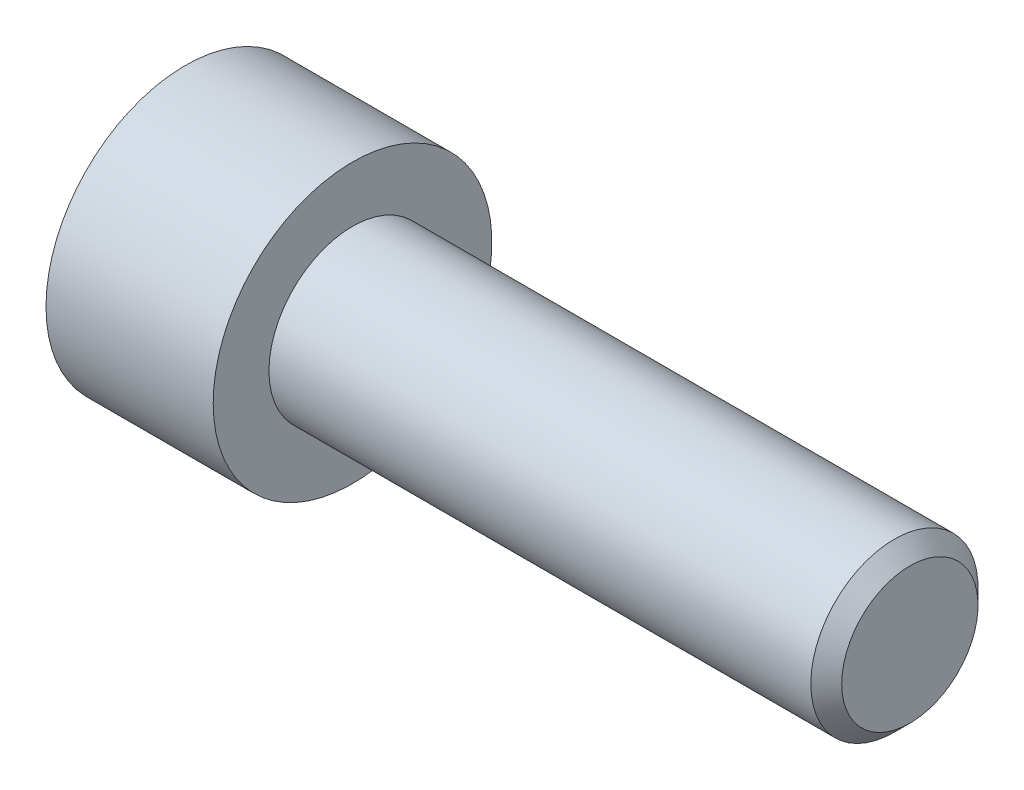
ISO-10303-21;
HEADER;
FILE_DESCRIPTION(('STEP AP214'),'2;1');
FILE_NAME('part.step','',(''),(''),'','','');
FILE_SCHEMA(('AUTOMOTIVE_DESIGN { 1 0 10303 214 1 1 1 1 }'));
ENDSEC;
DATA;
#1=APPLICATION_CONTEXT('core data for automotive mechanical design processes');
#2=APPLICATION_PROTOCOL_DEFINITION('international standard','automotive_design',2000,#1);
#3=PRODUCT_CONTEXT('',#1,'mechanical');
#4=PRODUCT('Part','Part','',(#3));
#5=PRODUCT_RELATED_PRODUCT_CATEGORY('part','',(#4));
#6=PRODUCT_DEFINITION_FORMATION('','',#4);
#7=PRODUCT_DEFINITION_CONTEXT('part definition',#1,'design');
#8=PRODUCT_DEFINITION('design','',#6,#7);
#9=PRODUCT_DEFINITION_SHAPE('','',#8);
#10=(LENGTH_UNIT() NAMED_UNIT(*) SI_UNIT(.MILLI.,.METRE.));
#11=(NAMED_UNIT(*) PLANE_ANGLE_UNIT() SI_UNIT($,.RADIAN.));
#12=(NAMED_UNIT(*) SI_UNIT($,.STERADIAN.) SOLID_ANGLE_UNIT());
#13=UNCERTAINTY_MEASURE_WITH_UNIT(LENGTH_MEASURE(1.E-05),#10,'distance_accuracy_value','');
#14=(GEOMETRIC_REPRESENTATION_CONTEXT(3) GLOBAL_UNCERTAINTY_ASSIGNED_CONTEXT((#13)) GLOBAL_UNIT_ASSIGNED_CONTEXT((#10,
#11,#12)) REPRESENTATION_CONTEXT('',''));
#15=CARTESIAN_POINT('',(0.,0.,0.));
#16=DIRECTION('',(0.,0.,1.));
#17=DIRECTION('',(1.,0.,0.));
#18=AXIS2_PLACEMENT_3D('',#15,#16,#17);
#19=CARTESIAN_POINT('',(-6.,0.,0.));
#20=DIRECTION('',(1.,0.,0.));
#21=DIRECTION('',(0.,0.,-1.));
#22=AXIS2_PLACEMENT_3D('',#19,#20,#21);
#23=PLANE('',#22);
#24=DIRECTION('',(0.,0.866025403784438,-0.500000000000001));
#25=VECTOR('',#24,1.);
#26=CARTESIAN_POINT('',(-6.,0.,2.89829835133192));
#27=LINE('',#26,#25);
#28=CARTESIAN_POINT('',(-6.,0.,2.89829835133192));
#29=VERTEX_POINT('',#28);
#30=CARTESIAN_POINT('',(-6.,2.51,1.44914917566596));
#31=VERTEX_POINT('',#30);
#32=EDGE_CURVE('E124',#29,#31,#27,.T.);
#33=ORIENTED_EDGE('',*,*,#32,.F.);
#34=DIRECTION('',(0.,0.866025403784439,0.499999999999999));
#35=VECTOR('',#34,1.);
#36=CARTESIAN_POINT('',(-6.,-2.51,1.44914917566596));
#37=LINE('',#36,#35);
#38=CARTESIAN_POINT('',(-6.,-2.51,1.44914917566596));
#39=VERTEX_POINT('',#38);
#40=EDGE_CURVE('E50',#39,#29,#37,.T.);
#41=ORIENTED_EDGE('',*,*,#40,.F.);
#42=DIRECTION('',(0.,0.,1.));
#43=VECTOR('',#42,1.);
#44=CARTESIAN_POINT('',(-6.,-2.51,-1.44914917566596));
#45=LINE('',#44,#43);
#46=CARTESIAN_POINT('',(-6.,-2.51,-1.44914917566596));
#47=VERTEX_POINT('',#46);
#48=EDGE_CURVE('E133',#47,#39,#45,.T.);
#49=ORIENTED_EDGE('',*,*,#48,.F.);
#50=DIRECTION('',(0.,-0.866025403784438,0.5));
#51=VECTOR('',#50,1.);
#52=CARTESIAN_POINT('',(-6.,0.,-2.89829835133192));
#53=LINE('',#52,#51);
#54=CARTESIAN_POINT('',(-6.,0.,-2.89829835133192));
#55=VERTEX_POINT('',#54);
#56=EDGE_CURVE('E131',#55,#47,#53,.T.);
#57=ORIENTED_EDGE('',*,*,#56,.F.);
#58=DIRECTION('',(0.,-0.866025403784439,-0.499999999999999));
#59=VECTOR('',#58,1.);
#60=CARTESIAN_POINT('',(-6.,2.51,-1.44914917566596));
#61=LINE('',#60,#59);
#62=CARTESIAN_POINT('',(-6.,2.51,-1.44914917566596));
#63=VERTEX_POINT('',#62);
#64=EDGE_CURVE('E98',#63,#55,#61,.T.);
#65=ORIENTED_EDGE('',*,*,#64,.F.);
#66=DIRECTION('',(0.,0.,-1.));
#67=VECTOR('',#66,1.);
#68=CARTESIAN_POINT('',(-6.,2.51,1.44914917566596));
#69=LINE('',#68,#67);
#70=EDGE_CURVE('E127',#31,#63,#69,.T.);
#71=ORIENTED_EDGE('',*,*,#70,.F.);
#72=EDGE_LOOP('',(#33,#41,#49,#57,#65,#71));
#73=FACE_BOUND('',#72,.T.);
#74=CARTESIAN_POINT('',(-6.,0.,0.));
#75=DIRECTION('',(-1.,0.,0.));
#76=DIRECTION('',(0.,0.,1.));
#77=AXIS2_PLACEMENT_3D('',#74,#75,#76);
#78=CIRCLE('',#77,5.);
#79=CARTESIAN_POINT('',(-6.,0.,5.));
#80=VERTEX_POINT('',#79);
#81=EDGE_CURVE('E11',#80,#80,#78,.T.);
#82=ORIENTED_EDGE('',*,*,#81,.T.);
#83=EDGE_LOOP('',(#82));
#84=FACE_BOUND('',#83,.T.);
#85=ADVANCED_FACE('F36',(#73,#84),#23,.F.);
#86=CARTESIAN_POINT('',(-6.,0.,0.));
#87=DIRECTION('',(-1.,0.,0.));
#88=DIRECTION('',(0.,0.,1.));
#89=AXIS2_PLACEMENT_3D('',#86,#87,#88);
#90=CYLINDRICAL_SURFACE('',#89,5.);
#91=ORIENTED_EDGE('',*,*,#81,.F.);
#92=EDGE_LOOP('',(#91));
#93=FACE_BOUND('',#92,.T.);
#94=CARTESIAN_POINT('',(0.,0.,0.));
#95=DIRECTION('',(-1.,0.,0.));
#96=DIRECTION('',(0.,0.,1.));
#97=AXIS2_PLACEMENT_3D('',#94,#95,#96);
#98=CIRCLE('',#97,5.);
#99=CARTESIAN_POINT('',(0.,0.,5.));
#100=VERTEX_POINT('',#99);
#101=EDGE_CURVE('E43',#100,#100,#98,.T.);
#102=ORIENTED_EDGE('',*,*,#101,.T.);
#103=EDGE_LOOP('',(#102));
#104=FACE_BOUND('',#103,.T.);
#105=ADVANCED_FACE('F153',(#93,#104),#90,.T.);
#106=CARTESIAN_POINT('',(0.,0.,-5.));
#107=DIRECTION('',(-1.,0.,0.));
#108=DIRECTION('',(0.,0.,1.));
#109=AXIS2_PLACEMENT_3D('',#106,#107,#108);
#110=PLANE('',#109);
#111=ORIENTED_EDGE('',*,*,#101,.F.);
#112=EDGE_LOOP('',(#111));
#113=FACE_BOUND('',#112,.T.);
#114=CARTESIAN_POINT('',(0.,0.,0.));
#115=DIRECTION('',(-1.,0.,0.));
#116=DIRECTION('',(0.,0.,1.));
#117=AXIS2_PLACEMENT_3D('',#114,#115,#116);
#118=CIRCLE('',#117,3.);
#119=CARTESIAN_POINT('',(0.,0.,3.));
#120=VERTEX_POINT('',#119);
#121=EDGE_CURVE('E148',#120,#120,#118,.T.);
#122=ORIENTED_EDGE('',*,*,#121,.T.);
#123=EDGE_LOOP('',(#122));
#124=FACE_BOUND('',#123,.T.);
#125=ADVANCED_FACE('F155',(#113,#124),#110,.F.);
#126=CARTESIAN_POINT('',(-6.,0.,0.));
#127=DIRECTION('',(-1.,0.,0.));
#128=DIRECTION('',(0.,0.,1.));
#129=AXIS2_PLACEMENT_3D('',#126,#127,#128);
#130=CYLINDRICAL_SURFACE('',#129,3.);
#131=ORIENTED_EDGE('',*,*,#121,.F.);
#132=EDGE_LOOP('',(#131));
#133=FACE_BOUND('',#132,.T.);
#134=CARTESIAN_POINT('',(19.4455,0.,0.));
#135=DIRECTION('',(-1.,0.,0.));
#136=DIRECTION('',(0.,0.,1.));
#137=AXIS2_PLACEMENT_3D('',#134,#135,#136);
#138=CIRCLE('',#137,3.);
#139=CARTESIAN_POINT('',(19.4455,0.,3.));
#140=VERTEX_POINT('',#139);
#141=EDGE_CURVE('E145',#140,#140,#138,.T.);
#142=ORIENTED_EDGE('',*,*,#141,.T.);
#143=EDGE_LOOP('',(#142));
#144=FACE_BOUND('',#143,.T.);
#145=ADVANCED_FACE('F158',(#133,#144),#130,.T.);
#146=CARTESIAN_POINT('',(20.,0.,0.));
#147=DIRECTION('',(-1.,0.,0.));
#148=DIRECTION('',(0.,0.,1.));
#149=AXIS2_PLACEMENT_3D('',#146,#147,#148);
#150=CONICAL_SURFACE('',#149,2.4455,0.785398163397449);
#151=ORIENTED_EDGE('',*,*,#141,.F.);
#152=EDGE_LOOP('',(#151));
#153=FACE_BOUND('',#152,.T.);
#154=CARTESIAN_POINT('',(20.,0.,0.));
#155=DIRECTION('',(-1.,0.,0.));
#156=DIRECTION('',(0.,0.,1.));
#157=AXIS2_PLACEMENT_3D('',#154,#155,#156);
#158=CIRCLE('',#157,2.4455);
#159=CARTESIAN_POINT('',(20.,0.,2.4455));
#160=VERTEX_POINT('',#159);
#161=EDGE_CURVE('E137',#160,#160,#158,.T.);
#162=ORIENTED_EDGE('',*,*,#161,.T.);
#163=EDGE_LOOP('',(#162));
#164=FACE_BOUND('',#163,.T.);
#165=ADVANCED_FACE('F164',(#153,#164),#150,.T.);
#166=CARTESIAN_POINT('',(20.,0.,-2.4455));
#167=DIRECTION('',(-1.,0.,0.));
#168=DIRECTION('',(0.,0.,1.));
#169=AXIS2_PLACEMENT_3D('',#166,#167,#168);
#170=PLANE('',#169);
#171=ORIENTED_EDGE('',*,*,#161,.F.);
#172=EDGE_LOOP('',(#171));
#173=FACE_BOUND('',#172,.T.);
#174=ADVANCED_FACE('F170',(#173),#170,.F.);
#175=CARTESIAN_POINT('',(-3.,-2.51,1.44914917566596));
#176=DIRECTION('',(0.,-0.499999999999999,0.866025403784439));
#177=DIRECTION('',(0.,-0.866025403784439,-0.499999999999999));
#178=AXIS2_PLACEMENT_3D('',#175,#176,#177);
#179=PLANE('',#178);
#180=ORIENTED_EDGE('',*,*,#40,.T.);
#181=DIRECTION('',(-1.,0.,0.));
#182=VECTOR('',#181,1.);
#183=CARTESIAN_POINT('',(-3.,0.,2.89829835133192));
#184=LINE('',#183,#182);
#185=CARTESIAN_POINT('',(-3.,0.,2.89829835133192));
#186=VERTEX_POINT('',#185);
#187=EDGE_CURVE('E80',#186,#29,#184,.T.);
#188=ORIENTED_EDGE('',*,*,#187,.F.);
#189=DIRECTION('',(0.,0.866025403784439,0.499999999999999));
#190=VECTOR('',#189,1.);
#191=CARTESIAN_POINT('',(-3.,-2.51,1.44914917566596));
#192=LINE('',#191,#190);
#193=CARTESIAN_POINT('',(-3.,-2.51,1.44914917566596));
#194=VERTEX_POINT('',#193);
#195=EDGE_CURVE('E135',#194,#186,#192,.T.);
#196=ORIENTED_EDGE('',*,*,#195,.F.);
#197=DIRECTION('',(-1.,0.,0.));
#198=VECTOR('',#197,1.);
#199=CARTESIAN_POINT('',(-3.,-2.51,1.44914917566596));
#200=LINE('',#199,#198);
#201=EDGE_CURVE('E58',#194,#39,#200,.T.);
#202=ORIENTED_EDGE('',*,*,#201,.T.);
#203=EDGE_LOOP('',(#180,#188,#196,#202));
#204=FACE_BOUND('',#203,.T.);
#205=ADVANCED_FACE('F175',(#204),#179,.F.);
#206=CARTESIAN_POINT('',(-3.,-2.51,-1.44914917566596));
#207=DIRECTION('',(0.,-1.,0.));
#208=DIRECTION('',(0.,0.,-1.));
#209=AXIS2_PLACEMENT_3D('',#206,#207,#208);
#210=PLANE('',#209);
#211=ORIENTED_EDGE('',*,*,#48,.T.);
#212=ORIENTED_EDGE('',*,*,#201,.F.);
#213=DIRECTION('',(0.,0.,1.));
#214=VECTOR('',#213,1.);
#215=CARTESIAN_POINT('',(-3.,-2.51,-1.44914917566596));
#216=LINE('',#215,#214);
#217=CARTESIAN_POINT('',(-3.,-2.51,-1.44914917566596));
#218=VERTEX_POINT('',#217);
#219=EDGE_CURVE('E110',#218,#194,#216,.T.);
#220=ORIENTED_EDGE('',*,*,#219,.F.);
#221=DIRECTION('',(-1.,0.,0.));
#222=VECTOR('',#221,1.);
#223=CARTESIAN_POINT('',(-3.,-2.51,-1.44914917566596));
#224=LINE('',#223,#222);
#225=EDGE_CURVE('E102',#218,#47,#224,.T.);
#226=ORIENTED_EDGE('',*,*,#225,.T.);
#227=EDGE_LOOP('',(#211,#212,#220,#226));
#228=FACE_BOUND('',#227,.T.);
#229=ADVANCED_FACE('F180',(#228),#210,.F.);
#230=CARTESIAN_POINT('',(-3.,0.,-2.89829835133192));
#231=DIRECTION('',(0.,-0.5,-0.866025403784438));
#232=DIRECTION('',(0.,0.866025403784438,-0.5));
#233=AXIS2_PLACEMENT_3D('',#230,#231,#232);
#234=PLANE('',#233);
#235=ORIENTED_EDGE('',*,*,#56,.T.);
#236=ORIENTED_EDGE('',*,*,#225,.F.);
#237=DIRECTION('',(0.,-0.866025403784438,0.5));
#238=VECTOR('',#237,1.);
#239=CARTESIAN_POINT('',(-3.,0.,-2.89829835133192));
#240=LINE('',#239,#238);
#241=CARTESIAN_POINT('',(-3.,0.,-2.89829835133192));
#242=VERTEX_POINT('',#241);
#243=EDGE_CURVE('E106',#242,#218,#240,.T.);
#244=ORIENTED_EDGE('',*,*,#243,.F.);
#245=DIRECTION('',(-1.,0.,0.));
#246=VECTOR('',#245,1.);
#247=CARTESIAN_POINT('',(-3.,0.,-2.89829835133192));
#248=LINE('',#247,#246);
#249=EDGE_CURVE('E91',#242,#55,#248,.T.);
#250=ORIENTED_EDGE('',*,*,#249,.T.);
#251=EDGE_LOOP('',(#235,#236,#244,#250));
#252=FACE_BOUND('',#251,.T.);
#253=ADVANCED_FACE('F107',(#252),#234,.F.);
#254=CARTESIAN_POINT('',(-3.,2.51,-1.44914917566596));
#255=DIRECTION('',(0.,0.5,-0.866025403784439));
#256=DIRECTION('',(0.,0.866025403784439,0.5));
#257=AXIS2_PLACEMENT_3D('',#254,#255,#256);
#258=PLANE('',#257);
#259=ORIENTED_EDGE('',*,*,#64,.T.);
#260=ORIENTED_EDGE('',*,*,#249,.F.);
#261=DIRECTION('',(0.,-0.866025403784439,-0.499999999999999));
#262=VECTOR('',#261,1.);
#263=CARTESIAN_POINT('',(-3.,2.51,-1.44914917566596));
#264=LINE('',#263,#262);
#265=CARTESIAN_POINT('',(-3.,2.51,-1.44914917566596));
#266=VERTEX_POINT('',#265);
#267=EDGE_CURVE('E95',#266,#242,#264,.T.);
#268=ORIENTED_EDGE('',*,*,#267,.F.);
#269=DIRECTION('',(-1.,0.,0.));
#270=VECTOR('',#269,1.);
#271=CARTESIAN_POINT('',(-3.,2.51,-1.44914917566596));
#272=LINE('',#271,#270);
#273=EDGE_CURVE('E103',#266,#63,#272,.T.);
#274=ORIENTED_EDGE('',*,*,#273,.T.);
#275=EDGE_LOOP('',(#259,#260,#268,#274));
#276=FACE_BOUND('',#275,.T.);
#277=ADVANCED_FACE('F93',(#276),#258,.F.);
#278=CARTESIAN_POINT('',(-3.,2.51,1.44914917566596));
#279=DIRECTION('',(0.,1.,0.));
#280=DIRECTION('',(0.,0.,1.));
#281=AXIS2_PLACEMENT_3D('',#278,#279,#280);
#282=PLANE('',#281);
#283=ORIENTED_EDGE('',*,*,#70,.T.);
#284=ORIENTED_EDGE('',*,*,#273,.F.);
#285=DIRECTION('',(0.,0.,-1.));
#286=VECTOR('',#285,1.);
#287=CARTESIAN_POINT('',(-3.,2.51,1.44914917566596));
#288=LINE('',#287,#286);
#289=CARTESIAN_POINT('',(-3.,2.51,1.44914917566596));
#290=VERTEX_POINT('',#289);
#291=EDGE_CURVE('E116',#290,#266,#288,.T.);
#292=ORIENTED_EDGE('',*,*,#291,.F.);
#293=DIRECTION('',(-1.,0.,0.));
#294=VECTOR('',#293,1.);
#295=CARTESIAN_POINT('',(-3.,2.51,1.44914917566596));
#296=LINE('',#295,#294);
#297=EDGE_CURVE('E140',#290,#31,#296,.T.);
#298=ORIENTED_EDGE('',*,*,#297,.T.);
#299=EDGE_LOOP('',(#283,#284,#292,#298));
#300=FACE_BOUND('',#299,.T.);
#301=ADVANCED_FACE('F206',(#300),#282,.F.);
#302=CARTESIAN_POINT('',(-3.,0.,2.89829835133192));
#303=DIRECTION('',(0.,0.5,0.866025403784438));
#304=DIRECTION('',(0.,-0.866025403784438,0.500000000000001));
#305=AXIS2_PLACEMENT_3D('',#302,#303,#304);
#306=PLANE('',#305);
#307=ORIENTED_EDGE('',*,*,#32,.T.);
#308=ORIENTED_EDGE('',*,*,#297,.F.);
#309=DIRECTION('',(0.,0.866025403784438,-0.500000000000001));
#310=VECTOR('',#309,1.);
#311=CARTESIAN_POINT('',(-3.,0.,2.89829835133192));
#312=LINE('',#311,#310);
#313=EDGE_CURVE('E118',#186,#290,#312,.T.);
#314=ORIENTED_EDGE('',*,*,#313,.F.);
#315=ORIENTED_EDGE('',*,*,#187,.T.);
#316=EDGE_LOOP('',(#307,#308,#314,#315));
#317=FACE_BOUND('',#316,.T.);
#318=ADVANCED_FACE('F194',(#317),#306,.F.);
#319=CARTESIAN_POINT('',(-3.,0.,2.89829835133192));
#320=DIRECTION('',(-1.,0.,0.));
#321=DIRECTION('',(0.,0.,1.));
#322=AXIS2_PLACEMENT_3D('',#319,#320,#321);
#323=PLANE('',#322);
#324=ORIENTED_EDGE('',*,*,#195,.T.);
#325=ORIENTED_EDGE('',*,*,#313,.T.);
#326=ORIENTED_EDGE('',*,*,#291,.T.);
#327=ORIENTED_EDGE('',*,*,#267,.T.);
#328=ORIENTED_EDGE('',*,*,#243,.T.);
#329=ORIENTED_EDGE('',*,*,#219,.T.);
#330=EDGE_LOOP('',(#324,#325,#326,#327,#328,#329));
#331=FACE_BOUND('',#330,.T.);
#332=ADVANCED_FACE('F113',(#331),#323,.T.);
#333=CLOSED_SHELL('',(#85,#105,#125,#145,#165,#174,#205,#229,#253,#277,#301,#318,#332));
#334=MANIFOLD_SOLID_BREP('B2',#333);
#335=ADVANCED_BREP_SHAPE_REPRESENTATION('',(#18,#334),#14);
#336=SHAPE_DEFINITION_REPRESENTATION(#9,#335);
ENDSEC;
END-ISO-10303-21;
